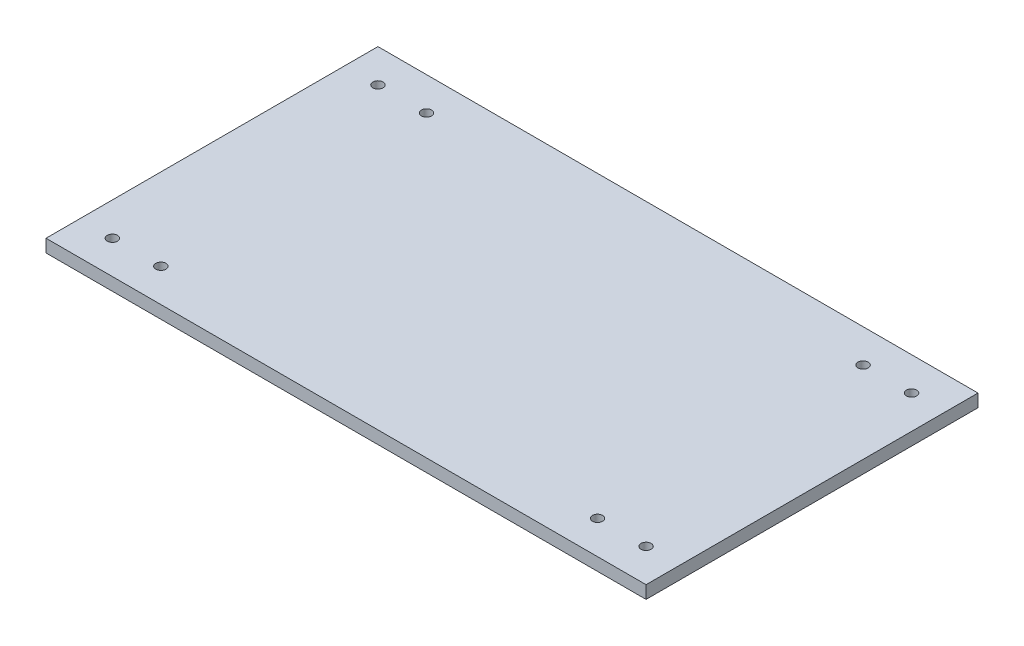
ISO-10303-21;
HEADER;
FILE_DESCRIPTION(('STEP AP214'),'2;1');
FILE_NAME('part.step','',(''),(''),'','','');
FILE_SCHEMA(('AUTOMOTIVE_DESIGN { 1 0 10303 214 1 1 1 1 }'));
ENDSEC;
DATA;
#1=APPLICATION_CONTEXT('core data for automotive mechanical design processes');
#2=APPLICATION_PROTOCOL_DEFINITION('international standard','automotive_design',2000,#1);
#3=PRODUCT_CONTEXT('',#1,'mechanical');
#4=PRODUCT('Part','Part','',(#3));
#5=PRODUCT_RELATED_PRODUCT_CATEGORY('part','',(#4));
#6=PRODUCT_DEFINITION_FORMATION('','',#4);
#7=PRODUCT_DEFINITION_CONTEXT('part definition',#1,'design');
#8=PRODUCT_DEFINITION('design','',#6,#7);
#9=PRODUCT_DEFINITION_SHAPE('','',#8);
#10=(LENGTH_UNIT() NAMED_UNIT(*) SI_UNIT(.MILLI.,.METRE.));
#11=(NAMED_UNIT(*) PLANE_ANGLE_UNIT() SI_UNIT($,.RADIAN.));
#12=(NAMED_UNIT(*) SI_UNIT($,.STERADIAN.) SOLID_ANGLE_UNIT());
#13=UNCERTAINTY_MEASURE_WITH_UNIT(LENGTH_MEASURE(1.E-05),#10,'distance_accuracy_value','');
#14=(GEOMETRIC_REPRESENTATION_CONTEXT(3) GLOBAL_UNCERTAINTY_ASSIGNED_CONTEXT((#13)) GLOBAL_UNIT_ASSIGNED_CONTEXT((#10,
#11,#12)) REPRESENTATION_CONTEXT('',''));
#15=CARTESIAN_POINT('',(0.,0.,0.));
#16=DIRECTION('',(0.,0.,1.));
#17=DIRECTION('',(1.,0.,0.));
#18=AXIS2_PLACEMENT_3D('',#15,#16,#17);
#19=CARTESIAN_POINT('',(149.225,6.35,82.55));
#20=DIRECTION('',(-1.,0.,0.));
#21=DIRECTION('',(0.,0.,1.));
#22=AXIS2_PLACEMENT_3D('',#19,#20,#21);
#23=PLANE('',#22);
#24=DIRECTION('',(0.,0.,-1.));
#25=VECTOR('',#24,1.);
#26=CARTESIAN_POINT('',(149.225,0.,82.55));
#27=LINE('',#26,#25);
#28=CARTESIAN_POINT('',(149.225,0.,82.55));
#29=VERTEX_POINT('',#28);
#30=CARTESIAN_POINT('',(149.225,0.,-82.55));
#31=VERTEX_POINT('',#30);
#32=EDGE_CURVE('E97',#29,#31,#27,.T.);
#33=ORIENTED_EDGE('',*,*,#32,.T.);
#34=DIRECTION('',(0.,-1.,0.));
#35=VECTOR('',#34,1.);
#36=CARTESIAN_POINT('',(149.225,6.35,-82.55));
#37=LINE('',#36,#35);
#38=CARTESIAN_POINT('',(149.225,6.35,-82.55));
#39=VERTEX_POINT('',#38);
#40=EDGE_CURVE('E11',#39,#31,#37,.T.);
#41=ORIENTED_EDGE('',*,*,#40,.F.);
#42=DIRECTION('',(0.,0.,-1.));
#43=VECTOR('',#42,1.);
#44=CARTESIAN_POINT('',(149.225,6.35,82.55));
#45=LINE('',#44,#43);
#46=CARTESIAN_POINT('',(149.225,6.35,82.55));
#47=VERTEX_POINT('',#46);
#48=EDGE_CURVE('E85',#47,#39,#45,.T.);
#49=ORIENTED_EDGE('',*,*,#48,.F.);
#50=DIRECTION('',(0.,-1.,0.));
#51=VECTOR('',#50,1.);
#52=CARTESIAN_POINT('',(149.225,6.35,82.55));
#53=LINE('',#52,#51);
#54=EDGE_CURVE('E93',#47,#29,#53,.T.);
#55=ORIENTED_EDGE('',*,*,#54,.T.);
#56=EDGE_LOOP('',(#33,#41,#49,#55));
#57=FACE_BOUND('',#56,.T.);
#58=ADVANCED_FACE('F34',(#57),#23,.F.);
#59=CARTESIAN_POINT('',(-149.225,6.35,-82.55));
#60=DIRECTION('',(0.,0.,1.));
#61=DIRECTION('',(1.,0.,0.));
#62=AXIS2_PLACEMENT_3D('',#59,#60,#61);
#63=PLANE('',#62);
#64=DIRECTION('',(-1.,0.,0.));
#65=VECTOR('',#64,1.);
#66=CARTESIAN_POINT('',(-149.225,0.,-82.55));
#67=LINE('',#66,#65);
#68=CARTESIAN_POINT('',(-149.225,0.,-82.55));
#69=VERTEX_POINT('',#68);
#70=EDGE_CURVE('E89',#31,#69,#67,.T.);
#71=ORIENTED_EDGE('',*,*,#70,.T.);
#72=DIRECTION('',(0.,-1.,0.));
#73=VECTOR('',#72,1.);
#74=CARTESIAN_POINT('',(-149.225,6.35,-82.55));
#75=LINE('',#74,#73);
#76=CARTESIAN_POINT('',(-149.225,6.35,-82.55));
#77=VERTEX_POINT('',#76);
#78=EDGE_CURVE('E42',#77,#69,#75,.T.);
#79=ORIENTED_EDGE('',*,*,#78,.F.);
#80=DIRECTION('',(-1.,0.,0.));
#81=VECTOR('',#80,1.);
#82=CARTESIAN_POINT('',(-149.225,6.35,-82.55));
#83=LINE('',#82,#81);
#84=EDGE_CURVE('E80',#39,#77,#83,.T.);
#85=ORIENTED_EDGE('',*,*,#84,.F.);
#86=ORIENTED_EDGE('',*,*,#40,.T.);
#87=EDGE_LOOP('',(#71,#79,#85,#86));
#88=FACE_BOUND('',#87,.T.);
#89=ADVANCED_FACE('F88',(#88),#63,.F.);
#90=CARTESIAN_POINT('',(-149.225,6.35,82.55));
#91=DIRECTION('',(1.,0.,0.));
#92=DIRECTION('',(0.,0.,-1.));
#93=AXIS2_PLACEMENT_3D('',#90,#91,#92);
#94=PLANE('',#93);
#95=DIRECTION('',(0.,0.,1.));
#96=VECTOR('',#95,1.);
#97=CARTESIAN_POINT('',(-149.225,0.,82.55));
#98=LINE('',#97,#96);
#99=CARTESIAN_POINT('',(-149.225,0.,82.55));
#100=VERTEX_POINT('',#99);
#101=EDGE_CURVE('E67',#69,#100,#98,.T.);
#102=ORIENTED_EDGE('',*,*,#101,.T.);
#103=DIRECTION('',(0.,-1.,0.));
#104=VECTOR('',#103,1.);
#105=CARTESIAN_POINT('',(-149.225,6.35,82.55));
#106=LINE('',#105,#104);
#107=CARTESIAN_POINT('',(-149.225,6.35,82.55));
#108=VERTEX_POINT('',#107);
#109=EDGE_CURVE('E90',#108,#100,#106,.T.);
#110=ORIENTED_EDGE('',*,*,#109,.F.);
#111=DIRECTION('',(0.,0.,1.));
#112=VECTOR('',#111,1.);
#113=CARTESIAN_POINT('',(-149.225,6.35,82.55));
#114=LINE('',#113,#112);
#115=EDGE_CURVE('E83',#77,#108,#114,.T.);
#116=ORIENTED_EDGE('',*,*,#115,.F.);
#117=ORIENTED_EDGE('',*,*,#78,.T.);
#118=EDGE_LOOP('',(#102,#110,#116,#117));
#119=FACE_BOUND('',#118,.T.);
#120=ADVANCED_FACE('F91',(#119),#94,.F.);
#121=CARTESIAN_POINT('',(-149.225,6.35,82.55));
#122=DIRECTION('',(0.,0.,-1.));
#123=DIRECTION('',(-1.,0.,0.));
#124=AXIS2_PLACEMENT_3D('',#121,#122,#123);
#125=PLANE('',#124);
#126=DIRECTION('',(1.,0.,0.));
#127=VECTOR('',#126,1.);
#128=CARTESIAN_POINT('',(-149.225,0.,82.55));
#129=LINE('',#128,#127);
#130=EDGE_CURVE('E73',#100,#29,#129,.T.);
#131=ORIENTED_EDGE('',*,*,#130,.T.);
#132=ORIENTED_EDGE('',*,*,#54,.F.);
#133=DIRECTION('',(1.,0.,0.));
#134=VECTOR('',#133,1.);
#135=CARTESIAN_POINT('',(-149.225,6.35,82.55));
#136=LINE('',#135,#134);
#137=EDGE_CURVE('E50',#108,#47,#136,.T.);
#138=ORIENTED_EDGE('',*,*,#137,.F.);
#139=ORIENTED_EDGE('',*,*,#109,.T.);
#140=EDGE_LOOP('',(#131,#132,#138,#139));
#141=FACE_BOUND('',#140,.T.);
#142=ADVANCED_FACE('F105',(#141),#125,.F.);
#143=CARTESIAN_POINT('',(0.,6.35,0.));
#144=DIRECTION('',(0.,-1.,0.));
#145=DIRECTION('',(0.,0.,-1.));
#146=AXIS2_PLACEMENT_3D('',#143,#144,#145);
#147=PLANE('',#146);
#148=CARTESIAN_POINT('',(-108.585,6.35,-66.04));
#149=DIRECTION('',(0.,1.,0.));
#150=DIRECTION('',(0.,0.,1.));
#151=AXIS2_PLACEMENT_3D('',#148,#149,#150);
#152=CIRCLE('',#151,2.53999999999999);
#153=CARTESIAN_POINT('',(-108.585,6.35,-63.5));
#154=VERTEX_POINT('',#153);
#155=EDGE_CURVE('E155',#154,#154,#152,.T.);
#156=ORIENTED_EDGE('',*,*,#155,.F.);
#157=EDGE_LOOP('',(#156));
#158=FACE_BOUND('',#157,.T.);
#159=CARTESIAN_POINT('',(-132.715,6.35,-66.04));
#160=DIRECTION('',(0.,1.,0.));
#161=DIRECTION('',(0.,0.,1.));
#162=AXIS2_PLACEMENT_3D('',#159,#160,#161);
#163=CIRCLE('',#162,2.53999999999998);
#164=CARTESIAN_POINT('',(-132.715,6.35,-63.5));
#165=VERTEX_POINT('',#164);
#166=EDGE_CURVE('E149',#165,#165,#163,.T.);
#167=ORIENTED_EDGE('',*,*,#166,.F.);
#168=EDGE_LOOP('',(#167));
#169=FACE_BOUND('',#168,.T.);
#170=CARTESIAN_POINT('',(108.585,6.35,-66.04));
#171=DIRECTION('',(0.,1.,0.));
#172=DIRECTION('',(0.,0.,1.));
#173=AXIS2_PLACEMENT_3D('',#170,#171,#172);
#174=CIRCLE('',#173,2.53999999999999);
#175=CARTESIAN_POINT('',(108.585,6.35,-63.5));
#176=VERTEX_POINT('',#175);
#177=EDGE_CURVE('E143',#176,#176,#174,.T.);
#178=ORIENTED_EDGE('',*,*,#177,.F.);
#179=EDGE_LOOP('',(#178));
#180=FACE_BOUND('',#179,.T.);
#181=CARTESIAN_POINT('',(132.715,6.35,-66.04));
#182=DIRECTION('',(0.,1.,0.));
#183=DIRECTION('',(0.,0.,1.));
#184=AXIS2_PLACEMENT_3D('',#181,#182,#183);
#185=CIRCLE('',#184,2.53999999999998);
#186=CARTESIAN_POINT('',(132.715,6.35,-63.5));
#187=VERTEX_POINT('',#186);
#188=EDGE_CURVE('E137',#187,#187,#185,.T.);
#189=ORIENTED_EDGE('',*,*,#188,.F.);
#190=EDGE_LOOP('',(#189));
#191=FACE_BOUND('',#190,.T.);
#192=CARTESIAN_POINT('',(-108.585,6.35,66.04));
#193=DIRECTION('',(0.,1.,0.));
#194=DIRECTION('',(0.,0.,1.));
#195=AXIS2_PLACEMENT_3D('',#192,#193,#194);
#196=CIRCLE('',#195,2.53999999999999);
#197=CARTESIAN_POINT('',(-108.585,6.35,68.58));
#198=VERTEX_POINT('',#197);
#199=EDGE_CURVE('E131',#198,#198,#196,.T.);
#200=ORIENTED_EDGE('',*,*,#199,.F.);
#201=EDGE_LOOP('',(#200));
#202=FACE_BOUND('',#201,.T.);
#203=CARTESIAN_POINT('',(-132.715,6.35,66.04));
#204=DIRECTION('',(0.,1.,0.));
#205=DIRECTION('',(0.,0.,1.));
#206=AXIS2_PLACEMENT_3D('',#203,#204,#205);
#207=CIRCLE('',#206,2.53999999999998);
#208=CARTESIAN_POINT('',(-132.715,6.35,68.58));
#209=VERTEX_POINT('',#208);
#210=EDGE_CURVE('E125',#209,#209,#207,.T.);
#211=ORIENTED_EDGE('',*,*,#210,.F.);
#212=EDGE_LOOP('',(#211));
#213=FACE_BOUND('',#212,.T.);
#214=CARTESIAN_POINT('',(108.585,6.35,66.04));
#215=DIRECTION('',(0.,1.,0.));
#216=DIRECTION('',(0.,0.,1.));
#217=AXIS2_PLACEMENT_3D('',#214,#215,#216);
#218=CIRCLE('',#217,2.53999999999999);
#219=CARTESIAN_POINT('',(108.585,6.35,68.58));
#220=VERTEX_POINT('',#219);
#221=EDGE_CURVE('E119',#220,#220,#218,.T.);
#222=ORIENTED_EDGE('',*,*,#221,.F.);
#223=EDGE_LOOP('',(#222));
#224=FACE_BOUND('',#223,.T.);
#225=CARTESIAN_POINT('',(132.715,6.35,66.04));
#226=DIRECTION('',(0.,1.,0.));
#227=DIRECTION('',(0.,0.,1.));
#228=AXIS2_PLACEMENT_3D('',#225,#226,#227);
#229=CIRCLE('',#228,2.53999999999998);
#230=CARTESIAN_POINT('',(132.715,6.35,68.58));
#231=VERTEX_POINT('',#230);
#232=EDGE_CURVE('E113',#231,#231,#229,.T.);
#233=ORIENTED_EDGE('',*,*,#232,.F.);
#234=EDGE_LOOP('',(#233));
#235=FACE_BOUND('',#234,.T.);
#236=ORIENTED_EDGE('',*,*,#48,.T.);
#237=ORIENTED_EDGE('',*,*,#84,.T.);
#238=ORIENTED_EDGE('',*,*,#115,.T.);
#239=ORIENTED_EDGE('',*,*,#137,.T.);
#240=EDGE_LOOP('',(#236,#237,#238,#239));
#241=FACE_BOUND('',#240,.T.);
#242=ADVANCED_FACE('F81',(#158,#169,#180,#191,#202,#213,#224,#235,#241),#147,.F.);
#243=CARTESIAN_POINT('',(0.,0.,0.));
#244=DIRECTION('',(0.,-1.,0.));
#245=DIRECTION('',(0.,0.,-1.));
#246=AXIS2_PLACEMENT_3D('',#243,#244,#245);
#247=PLANE('',#246);
#248=CARTESIAN_POINT('',(-108.585,0.,-66.04));
#249=DIRECTION('',(0.,-1.,0.));
#250=DIRECTION('',(0.,0.,-1.));
#251=AXIS2_PLACEMENT_3D('',#248,#249,#250);
#252=CIRCLE('',#251,2.53999999999999);
#253=CARTESIAN_POINT('',(-108.585,0.,-68.58));
#254=VERTEX_POINT('',#253);
#255=EDGE_CURVE('E152',#254,#254,#252,.F.);
#256=ORIENTED_EDGE('',*,*,#255,.T.);
#257=EDGE_LOOP('',(#256));
#258=FACE_BOUND('',#257,.T.);
#259=CARTESIAN_POINT('',(-132.715,0.,-66.04));
#260=DIRECTION('',(0.,-1.,0.));
#261=DIRECTION('',(0.,0.,-1.));
#262=AXIS2_PLACEMENT_3D('',#259,#260,#261);
#263=CIRCLE('',#262,2.53999999999998);
#264=CARTESIAN_POINT('',(-132.715,0.,-68.58));
#265=VERTEX_POINT('',#264);
#266=EDGE_CURVE('E146',#265,#265,#263,.F.);
#267=ORIENTED_EDGE('',*,*,#266,.T.);
#268=EDGE_LOOP('',(#267));
#269=FACE_BOUND('',#268,.T.);
#270=CARTESIAN_POINT('',(108.585,0.,-66.04));
#271=DIRECTION('',(0.,-1.,0.));
#272=DIRECTION('',(0.,0.,-1.));
#273=AXIS2_PLACEMENT_3D('',#270,#271,#272);
#274=CIRCLE('',#273,2.53999999999999);
#275=CARTESIAN_POINT('',(108.585,0.,-68.58));
#276=VERTEX_POINT('',#275);
#277=EDGE_CURVE('E140',#276,#276,#274,.F.);
#278=ORIENTED_EDGE('',*,*,#277,.T.);
#279=EDGE_LOOP('',(#278));
#280=FACE_BOUND('',#279,.T.);
#281=CARTESIAN_POINT('',(132.715,0.,-66.04));
#282=DIRECTION('',(0.,-1.,0.));
#283=DIRECTION('',(0.,0.,-1.));
#284=AXIS2_PLACEMENT_3D('',#281,#282,#283);
#285=CIRCLE('',#284,2.53999999999998);
#286=CARTESIAN_POINT('',(132.715,0.,-68.58));
#287=VERTEX_POINT('',#286);
#288=EDGE_CURVE('E134',#287,#287,#285,.F.);
#289=ORIENTED_EDGE('',*,*,#288,.T.);
#290=EDGE_LOOP('',(#289));
#291=FACE_BOUND('',#290,.T.);
#292=CARTESIAN_POINT('',(-108.585,0.,66.04));
#293=DIRECTION('',(0.,-1.,0.));
#294=DIRECTION('',(0.,0.,-1.));
#295=AXIS2_PLACEMENT_3D('',#292,#293,#294);
#296=CIRCLE('',#295,2.53999999999999);
#297=CARTESIAN_POINT('',(-108.585,0.,63.5));
#298=VERTEX_POINT('',#297);
#299=EDGE_CURVE('E128',#298,#298,#296,.F.);
#300=ORIENTED_EDGE('',*,*,#299,.T.);
#301=EDGE_LOOP('',(#300));
#302=FACE_BOUND('',#301,.T.);
#303=CARTESIAN_POINT('',(-132.715,0.,66.04));
#304=DIRECTION('',(0.,-1.,0.));
#305=DIRECTION('',(0.,0.,-1.));
#306=AXIS2_PLACEMENT_3D('',#303,#304,#305);
#307=CIRCLE('',#306,2.53999999999998);
#308=CARTESIAN_POINT('',(-132.715,0.,63.5));
#309=VERTEX_POINT('',#308);
#310=EDGE_CURVE('E122',#309,#309,#307,.F.);
#311=ORIENTED_EDGE('',*,*,#310,.T.);
#312=EDGE_LOOP('',(#311));
#313=FACE_BOUND('',#312,.T.);
#314=CARTESIAN_POINT('',(108.585,0.,66.04));
#315=DIRECTION('',(0.,-1.,0.));
#316=DIRECTION('',(0.,0.,-1.));
#317=AXIS2_PLACEMENT_3D('',#314,#315,#316);
#318=CIRCLE('',#317,2.53999999999999);
#319=CARTESIAN_POINT('',(108.585,0.,63.5));
#320=VERTEX_POINT('',#319);
#321=EDGE_CURVE('E116',#320,#320,#318,.F.);
#322=ORIENTED_EDGE('',*,*,#321,.T.);
#323=EDGE_LOOP('',(#322));
#324=FACE_BOUND('',#323,.T.);
#325=CARTESIAN_POINT('',(132.715,0.,66.04));
#326=DIRECTION('',(0.,-1.,0.));
#327=DIRECTION('',(0.,0.,-1.));
#328=AXIS2_PLACEMENT_3D('',#325,#326,#327);
#329=CIRCLE('',#328,2.53999999999998);
#330=CARTESIAN_POINT('',(132.715,0.,63.5));
#331=VERTEX_POINT('',#330);
#332=EDGE_CURVE('E100',#331,#331,#329,.F.);
#333=ORIENTED_EDGE('',*,*,#332,.T.);
#334=EDGE_LOOP('',(#333));
#335=FACE_BOUND('',#334,.T.);
#336=ORIENTED_EDGE('',*,*,#32,.F.);
#337=ORIENTED_EDGE('',*,*,#130,.F.);
#338=ORIENTED_EDGE('',*,*,#101,.F.);
#339=ORIENTED_EDGE('',*,*,#70,.F.);
#340=EDGE_LOOP('',(#336,#337,#338,#339));
#341=FACE_BOUND('',#340,.T.);
#342=ADVANCED_FACE('F108',(#258,#269,#280,#291,#302,#313,#324,#335,#341),#247,.T.);
#343=CARTESIAN_POINT('',(132.715,-7.18420489685532,66.04));
#344=DIRECTION('',(0.,1.,0.));
#345=DIRECTION('',(0.,0.,1.));
#346=AXIS2_PLACEMENT_3D('',#343,#344,#345);
#347=CYLINDRICAL_SURFACE('',#346,2.53999999999998);
#348=ORIENTED_EDGE('',*,*,#232,.T.);
#349=EDGE_LOOP('',(#348));
#350=FACE_BOUND('',#349,.T.);
#351=ORIENTED_EDGE('',*,*,#332,.F.);
#352=EDGE_LOOP('',(#351));
#353=FACE_BOUND('',#352,.T.);
#354=ADVANCED_FACE('F179',(#350,#353),#347,.F.);
#355=CARTESIAN_POINT('',(108.585,-7.18420489685532,66.04));
#356=DIRECTION('',(0.,1.,0.));
#357=DIRECTION('',(0.,0.,1.));
#358=AXIS2_PLACEMENT_3D('',#355,#356,#357);
#359=CYLINDRICAL_SURFACE('',#358,2.53999999999999);
#360=ORIENTED_EDGE('',*,*,#221,.T.);
#361=EDGE_LOOP('',(#360));
#362=FACE_BOUND('',#361,.T.);
#363=ORIENTED_EDGE('',*,*,#321,.F.);
#364=EDGE_LOOP('',(#363));
#365=FACE_BOUND('',#364,.T.);
#366=ADVANCED_FACE('F182',(#362,#365),#359,.F.);
#367=CARTESIAN_POINT('',(-132.715,-7.18420489685532,66.04));
#368=DIRECTION('',(0.,1.,0.));
#369=DIRECTION('',(0.,0.,1.));
#370=AXIS2_PLACEMENT_3D('',#367,#368,#369);
#371=CYLINDRICAL_SURFACE('',#370,2.53999999999998);
#372=ORIENTED_EDGE('',*,*,#210,.T.);
#373=EDGE_LOOP('',(#372));
#374=FACE_BOUND('',#373,.T.);
#375=ORIENTED_EDGE('',*,*,#310,.F.);
#376=EDGE_LOOP('',(#375));
#377=FACE_BOUND('',#376,.T.);
#378=ADVANCED_FACE('F228',(#374,#377),#371,.F.);
#379=CARTESIAN_POINT('',(-108.585,-7.18420489685532,66.04));
#380=DIRECTION('',(0.,1.,0.));
#381=DIRECTION('',(0.,0.,1.));
#382=AXIS2_PLACEMENT_3D('',#379,#380,#381);
#383=CYLINDRICAL_SURFACE('',#382,2.53999999999999);
#384=ORIENTED_EDGE('',*,*,#199,.T.);
#385=EDGE_LOOP('',(#384));
#386=FACE_BOUND('',#385,.T.);
#387=ORIENTED_EDGE('',*,*,#299,.F.);
#388=EDGE_LOOP('',(#387));
#389=FACE_BOUND('',#388,.T.);
#390=ADVANCED_FACE('F236',(#386,#389),#383,.F.);
#391=CARTESIAN_POINT('',(132.715,-7.18420489685532,-66.04));
#392=DIRECTION('',(0.,1.,0.));
#393=DIRECTION('',(0.,0.,1.));
#394=AXIS2_PLACEMENT_3D('',#391,#392,#393);
#395=CYLINDRICAL_SURFACE('',#394,2.53999999999998);
#396=ORIENTED_EDGE('',*,*,#188,.T.);
#397=EDGE_LOOP('',(#396));
#398=FACE_BOUND('',#397,.T.);
#399=ORIENTED_EDGE('',*,*,#288,.F.);
#400=EDGE_LOOP('',(#399));
#401=FACE_BOUND('',#400,.T.);
#402=ADVANCED_FACE('F244',(#398,#401),#395,.F.);
#403=CARTESIAN_POINT('',(108.585,-7.18420489685532,-66.04));
#404=DIRECTION('',(0.,1.,0.));
#405=DIRECTION('',(0.,0.,1.));
#406=AXIS2_PLACEMENT_3D('',#403,#404,#405);
#407=CYLINDRICAL_SURFACE('',#406,2.53999999999999);
#408=ORIENTED_EDGE('',*,*,#177,.T.);
#409=EDGE_LOOP('',(#408));
#410=FACE_BOUND('',#409,.T.);
#411=ORIENTED_EDGE('',*,*,#277,.F.);
#412=EDGE_LOOP('',(#411));
#413=FACE_BOUND('',#412,.T.);
#414=ADVANCED_FACE('F252',(#410,#413),#407,.F.);
#415=CARTESIAN_POINT('',(-132.715,-7.18420489685532,-66.04));
#416=DIRECTION('',(0.,1.,0.));
#417=DIRECTION('',(0.,0.,1.));
#418=AXIS2_PLACEMENT_3D('',#415,#416,#417);
#419=CYLINDRICAL_SURFACE('',#418,2.53999999999998);
#420=ORIENTED_EDGE('',*,*,#166,.T.);
#421=EDGE_LOOP('',(#420));
#422=FACE_BOUND('',#421,.T.);
#423=ORIENTED_EDGE('',*,*,#266,.F.);
#424=EDGE_LOOP('',(#423));
#425=FACE_BOUND('',#424,.T.);
#426=ADVANCED_FACE('F259',(#422,#425),#419,.F.);
#427=CARTESIAN_POINT('',(-108.585,-7.18420489685532,-66.04));
#428=DIRECTION('',(0.,1.,0.));
#429=DIRECTION('',(0.,0.,1.));
#430=AXIS2_PLACEMENT_3D('',#427,#428,#429);
#431=CYLINDRICAL_SURFACE('',#430,2.53999999999999);
#432=ORIENTED_EDGE('',*,*,#155,.T.);
#433=EDGE_LOOP('',(#432));
#434=FACE_BOUND('',#433,.T.);
#435=ORIENTED_EDGE('',*,*,#255,.F.);
#436=EDGE_LOOP('',(#435));
#437=FACE_BOUND('',#436,.T.);
#438=ADVANCED_FACE('F159',(#434,#437),#431,.F.);
#439=CLOSED_SHELL('',(#58,#89,#120,#142,#242,#342,#354,#366,#378,#390,#402,#414,#426,#438));
#440=MANIFOLD_SOLID_BREP('B2',#439);
#441=ADVANCED_BREP_SHAPE_REPRESENTATION('',(#18,#440),#14);
#442=SHAPE_DEFINITION_REPRESENTATION(#9,#441);
ENDSEC;
END-ISO-10303-21;
